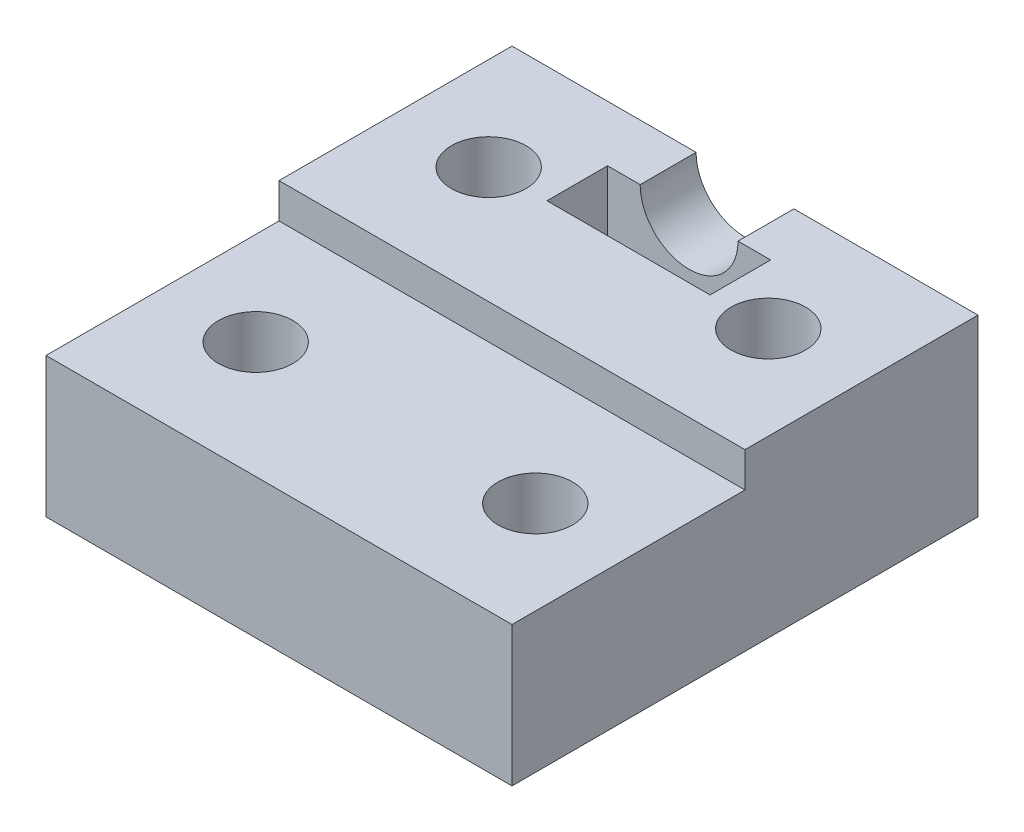
ISO-10303-21;
HEADER;
FILE_DESCRIPTION(('STEP AP214'),'2;1');
FILE_NAME('part.step','',(''),(''),'','','');
FILE_SCHEMA(('AUTOMOTIVE_DESIGN { 1 0 10303 214 1 1 1 1 }'));
ENDSEC;
DATA;
#1=APPLICATION_CONTEXT('core data for automotive mechanical design processes');
#2=APPLICATION_PROTOCOL_DEFINITION('international standard','automotive_design',2000,#1);
#3=PRODUCT_CONTEXT('',#1,'mechanical');
#4=PRODUCT('Part','Part','',(#3));
#5=PRODUCT_RELATED_PRODUCT_CATEGORY('part','',(#4));
#6=PRODUCT_DEFINITION_FORMATION('','',#4);
#7=PRODUCT_DEFINITION_CONTEXT('part definition',#1,'design');
#8=PRODUCT_DEFINITION('design','',#6,#7);
#9=PRODUCT_DEFINITION_SHAPE('','',#8);
#10=(LENGTH_UNIT() NAMED_UNIT(*) SI_UNIT(.MILLI.,.METRE.));
#11=(NAMED_UNIT(*) PLANE_ANGLE_UNIT() SI_UNIT($,.RADIAN.));
#12=(NAMED_UNIT(*) SI_UNIT($,.STERADIAN.) SOLID_ANGLE_UNIT());
#13=UNCERTAINTY_MEASURE_WITH_UNIT(LENGTH_MEASURE(1.E-05),#10,'distance_accuracy_value','');
#14=(GEOMETRIC_REPRESENTATION_CONTEXT(3) GLOBAL_UNCERTAINTY_ASSIGNED_CONTEXT((#13)) GLOBAL_UNIT_ASSIGNED_CONTEXT((#10,
#11,#12)) REPRESENTATION_CONTEXT('',''));
#15=CARTESIAN_POINT('',(0.,0.,0.));
#16=DIRECTION('',(0.,0.,1.));
#17=DIRECTION('',(1.,0.,0.));
#18=AXIS2_PLACEMENT_3D('',#15,#16,#17);
#19=CARTESIAN_POINT('',(0.,0.,0.));
#20=DIRECTION('',(0.,-1.,0.));
#21=DIRECTION('',(0.,0.,-1.));
#22=AXIS2_PLACEMENT_3D('',#19,#20,#21);
#23=PLANE('',#22);
#24=CARTESIAN_POINT('',(-6.,0.,-5.));
#25=DIRECTION('',(0.,1.,0.));
#26=DIRECTION('',(0.,0.,1.));
#27=AXIS2_PLACEMENT_3D('',#24,#25,#26);
#28=CIRCLE('',#27,1.6);
#29=CARTESIAN_POINT('',(-6.,0.,-3.4));
#30=VERTEX_POINT('',#29);
#31=EDGE_CURVE('E401',#30,#30,#28,.T.);
#32=ORIENTED_EDGE('',*,*,#31,.F.);
#33=EDGE_LOOP('',(#32));
#34=FACE_BOUND('',#33,.T.);
#35=CARTESIAN_POINT('',(6.,0.,-5.));
#36=DIRECTION('',(0.,1.,0.));
#37=DIRECTION('',(0.,0.,1.));
#38=AXIS2_PLACEMENT_3D('',#35,#36,#37);
#39=CIRCLE('',#38,1.6);
#40=CARTESIAN_POINT('',(6.,0.,-3.4));
#41=VERTEX_POINT('',#40);
#42=EDGE_CURVE('E403',#41,#41,#39,.T.);
#43=ORIENTED_EDGE('',*,*,#42,.F.);
#44=EDGE_LOOP('',(#43));
#45=FACE_BOUND('',#44,.T.);
#46=DIRECTION('',(-1.,0.,0.));
#47=VECTOR('',#46,1.);
#48=CARTESIAN_POINT('',(9.99999999999999,0.,-10.));
#49=LINE('',#48,#47);
#50=CARTESIAN_POINT('',(9.99999999999999,0.,-10.));
#51=VERTEX_POINT('',#50);
#52=CARTESIAN_POINT('',(2.1,0.,-10.));
#53=VERTEX_POINT('',#52);
#54=EDGE_CURVE('E134',#51,#53,#49,.T.);
#55=ORIENTED_EDGE('',*,*,#54,.T.);
#56=DIRECTION('',(0.,0.,1.));
#57=VECTOR('',#56,1.);
#58=CARTESIAN_POINT('',(2.1,0.,-10.));
#59=LINE('',#58,#57);
#60=CARTESIAN_POINT('',(2.1,0.,-7.6));
#61=VERTEX_POINT('',#60);
#62=EDGE_CURVE('E121',#53,#61,#59,.T.);
#63=ORIENTED_EDGE('',*,*,#62,.T.);
#64=DIRECTION('',(-1.,0.,0.));
#65=VECTOR('',#64,1.);
#66=CARTESIAN_POINT('',(0.,0.,-7.6));
#67=LINE('',#66,#65);
#68=CARTESIAN_POINT('',(3.5,0.,-7.6));
#69=VERTEX_POINT('',#68);
#70=EDGE_CURVE('E11',#69,#61,#67,.T.);
#71=ORIENTED_EDGE('',*,*,#70,.F.);
#72=DIRECTION('',(0.,0.,1.));
#73=VECTOR('',#72,1.);
#74=CARTESIAN_POINT('',(3.5,0.,0.));
#75=LINE('',#74,#73);
#76=CARTESIAN_POINT('',(3.5,0.,-5.));
#77=VERTEX_POINT('',#76);
#78=EDGE_CURVE('E166',#69,#77,#75,.T.);
#79=ORIENTED_EDGE('',*,*,#78,.T.);
#80=DIRECTION('',(-1.,0.,0.));
#81=VECTOR('',#80,1.);
#82=CARTESIAN_POINT('',(0.,0.,-5.));
#83=LINE('',#82,#81);
#84=CARTESIAN_POINT('',(-3.5,0.,-5.));
#85=VERTEX_POINT('',#84);
#86=EDGE_CURVE('E56',#77,#85,#83,.T.);
#87=ORIENTED_EDGE('',*,*,#86,.T.);
#88=DIRECTION('',(0.,0.,-1.));
#89=VECTOR('',#88,1.);
#90=CARTESIAN_POINT('',(-3.5,0.,0.));
#91=LINE('',#90,#89);
#92=CARTESIAN_POINT('',(-3.5,0.,-7.6));
#93=VERTEX_POINT('',#92);
#94=EDGE_CURVE('E165',#85,#93,#91,.T.);
#95=ORIENTED_EDGE('',*,*,#94,.T.);
#96=CARTESIAN_POINT('',(-2.1,0.,-7.6));
#97=VERTEX_POINT('',#96);
#98=EDGE_CURVE('E41',#97,#93,#67,.T.);
#99=ORIENTED_EDGE('',*,*,#98,.F.);
#100=DIRECTION('',(0.,0.,1.));
#101=VECTOR('',#100,1.);
#102=CARTESIAN_POINT('',(-2.1,0.,-10.));
#103=LINE('',#102,#101);
#104=CARTESIAN_POINT('',(-2.1,0.,-10.));
#105=VERTEX_POINT('',#104);
#106=EDGE_CURVE('E48',#97,#105,#103,.F.);
#107=ORIENTED_EDGE('',*,*,#106,.T.);
#108=CARTESIAN_POINT('',(-10.,0.,-10.));
#109=VERTEX_POINT('',#108);
#110=EDGE_CURVE('E136',#105,#109,#49,.T.);
#111=ORIENTED_EDGE('',*,*,#110,.T.);
#112=DIRECTION('',(0.,0.,1.));
#113=VECTOR('',#112,1.);
#114=CARTESIAN_POINT('',(-10.,0.,-10.));
#115=LINE('',#114,#113);
#116=CARTESIAN_POINT('',(-10.,0.,0.));
#117=VERTEX_POINT('',#116);
#118=EDGE_CURVE('E210',#109,#117,#115,.T.);
#119=ORIENTED_EDGE('',*,*,#118,.T.);
#120=DIRECTION('',(1.,0.,0.));
#121=VECTOR('',#120,1.);
#122=CARTESIAN_POINT('',(0.,0.,0.));
#123=LINE('',#122,#121);
#124=CARTESIAN_POINT('',(10.,0.,0.));
#125=VERTEX_POINT('',#124);
#126=EDGE_CURVE('E153',#117,#125,#123,.T.);
#127=ORIENTED_EDGE('',*,*,#126,.T.);
#128=DIRECTION('',(0.,0.,-1.));
#129=VECTOR('',#128,1.);
#130=CARTESIAN_POINT('',(9.99999999999999,0.,-10.));
#131=LINE('',#130,#129);
#132=EDGE_CURVE('E141',#125,#51,#131,.T.);
#133=ORIENTED_EDGE('',*,*,#132,.T.);
#134=EDGE_LOOP('',(#55,#63,#71,#79,#87,#95,#99,#107,#111,#119,#127,#133));
#135=FACE_BOUND('',#134,.T.);
#136=ADVANCED_FACE('F33',(#34,#45,#135),#23,.F.);
#137=CARTESIAN_POINT('',(-10.,-7.5,-10.));
#138=DIRECTION('',(-1.,0.,0.));
#139=DIRECTION('',(0.,0.,1.));
#140=AXIS2_PLACEMENT_3D('',#137,#138,#139);
#141=PLANE('',#140);
#142=DIRECTION('',(0.,0.,1.));
#143=VECTOR('',#142,1.);
#144=CARTESIAN_POINT('',(-10.,-1.5,0.));
#145=LINE('',#144,#143);
#146=CARTESIAN_POINT('',(-10.,-1.5,0.));
#147=VERTEX_POINT('',#146);
#148=CARTESIAN_POINT('',(-10.,-1.5,10.));
#149=VERTEX_POINT('',#148);
#150=EDGE_CURVE('E205',#147,#149,#145,.T.);
#151=ORIENTED_EDGE('',*,*,#150,.F.);
#152=DIRECTION('',(0.,-1.,0.));
#153=VECTOR('',#152,1.);
#154=CARTESIAN_POINT('',(-10.,1.5,0.));
#155=LINE('',#154,#153);
#156=EDGE_CURVE('E198',#117,#147,#155,.T.);
#157=ORIENTED_EDGE('',*,*,#156,.F.);
#158=ORIENTED_EDGE('',*,*,#118,.F.);
#159=DIRECTION('',(0.,1.,0.));
#160=VECTOR('',#159,1.);
#161=CARTESIAN_POINT('',(-10.,-7.5,-10.));
#162=LINE('',#161,#160);
#163=CARTESIAN_POINT('',(-10.,-7.5,-10.));
#164=VERTEX_POINT('',#163);
#165=EDGE_CURVE('E151',#164,#109,#162,.T.);
#166=ORIENTED_EDGE('',*,*,#165,.F.);
#167=DIRECTION('',(0.,0.,1.));
#168=VECTOR('',#167,1.);
#169=CARTESIAN_POINT('',(-10.,-7.5,-10.));
#170=LINE('',#169,#168);
#171=CARTESIAN_POINT('',(-10.,-7.5,10.));
#172=VERTEX_POINT('',#171);
#173=EDGE_CURVE('E143',#164,#172,#170,.T.);
#174=ORIENTED_EDGE('',*,*,#173,.T.);
#175=DIRECTION('',(0.,1.,0.));
#176=VECTOR('',#175,1.);
#177=CARTESIAN_POINT('',(-10.,-7.5,10.));
#178=LINE('',#177,#176);
#179=EDGE_CURVE('E159',#172,#149,#178,.T.);
#180=ORIENTED_EDGE('',*,*,#179,.T.);
#181=EDGE_LOOP('',(#151,#157,#158,#166,#174,#180));
#182=FACE_BOUND('',#181,.T.);
#183=ADVANCED_FACE('F35',(#182),#141,.T.);
#184=CARTESIAN_POINT('',(9.99999999999999,-7.5,-10.));
#185=DIRECTION('',(0.,0.,-1.));
#186=DIRECTION('',(-1.,0.,0.));
#187=AXIS2_PLACEMENT_3D('',#184,#185,#186);
#188=PLANE('',#187);
#189=CARTESIAN_POINT('',(0.,0.,-10.));
#190=DIRECTION('',(0.,0.,1.));
#191=DIRECTION('',(1.,0.,0.));
#192=AXIS2_PLACEMENT_3D('',#189,#190,#191);
#193=CIRCLE('',#192,2.1);
#194=EDGE_CURVE('E124',#105,#53,#193,.T.);
#195=ORIENTED_EDGE('',*,*,#194,.T.);
#196=ORIENTED_EDGE('',*,*,#54,.F.);
#197=DIRECTION('',(0.,1.,0.));
#198=VECTOR('',#197,1.);
#199=CARTESIAN_POINT('',(9.99999999999999,-7.5,-10.));
#200=LINE('',#199,#198);
#201=CARTESIAN_POINT('',(9.99999999999999,-7.5,-10.));
#202=VERTEX_POINT('',#201);
#203=EDGE_CURVE('E154',#202,#51,#200,.T.);
#204=ORIENTED_EDGE('',*,*,#203,.F.);
#205=DIRECTION('',(-1.,0.,0.));
#206=VECTOR('',#205,1.);
#207=CARTESIAN_POINT('',(9.99999999999999,-7.5,-10.));
#208=LINE('',#207,#206);
#209=EDGE_CURVE('E162',#202,#164,#208,.T.);
#210=ORIENTED_EDGE('',*,*,#209,.T.);
#211=ORIENTED_EDGE('',*,*,#165,.T.);
#212=ORIENTED_EDGE('',*,*,#110,.F.);
#213=EDGE_LOOP('',(#195,#196,#204,#210,#211,#212));
#214=FACE_BOUND('',#213,.T.);
#215=ADVANCED_FACE('F133',(#214),#188,.T.);
#216=CARTESIAN_POINT('',(9.99999999999999,-7.5,-10.));
#217=DIRECTION('',(1.,0.,0.));
#218=DIRECTION('',(0.,0.,-1.));
#219=AXIS2_PLACEMENT_3D('',#216,#217,#218);
#220=PLANE('',#219);
#221=DIRECTION('',(0.,0.,1.));
#222=VECTOR('',#221,1.);
#223=CARTESIAN_POINT('',(10.,-1.5,0.));
#224=LINE('',#223,#222);
#225=CARTESIAN_POINT('',(10.,-1.5,0.));
#226=VERTEX_POINT('',#225);
#227=CARTESIAN_POINT('',(10.,-1.5,10.));
#228=VERTEX_POINT('',#227);
#229=EDGE_CURVE('E207',#226,#228,#224,.T.);
#230=ORIENTED_EDGE('',*,*,#229,.T.);
#231=DIRECTION('',(0.,1.,0.));
#232=VECTOR('',#231,1.);
#233=CARTESIAN_POINT('',(10.,-7.5,10.));
#234=LINE('',#233,#232);
#235=CARTESIAN_POINT('',(10.,-7.5,10.));
#236=VERTEX_POINT('',#235);
#237=EDGE_CURVE('E156',#236,#228,#234,.T.);
#238=ORIENTED_EDGE('',*,*,#237,.F.);
#239=DIRECTION('',(0.,0.,-1.));
#240=VECTOR('',#239,1.);
#241=CARTESIAN_POINT('',(9.99999999999999,-7.5,-10.));
#242=LINE('',#241,#240);
#243=EDGE_CURVE('E214',#236,#202,#242,.T.);
#244=ORIENTED_EDGE('',*,*,#243,.T.);
#245=ORIENTED_EDGE('',*,*,#203,.T.);
#246=ORIENTED_EDGE('',*,*,#132,.F.);
#247=DIRECTION('',(0.,1.,0.));
#248=VECTOR('',#247,1.);
#249=CARTESIAN_POINT('',(10.,1.5,0.));
#250=LINE('',#249,#248);
#251=EDGE_CURVE('E203',#226,#125,#250,.T.);
#252=ORIENTED_EDGE('',*,*,#251,.F.);
#253=EDGE_LOOP('',(#230,#238,#244,#245,#246,#252));
#254=FACE_BOUND('',#253,.T.);
#255=ADVANCED_FACE('F232',(#254),#220,.T.);
#256=CARTESIAN_POINT('',(10.,-7.5,10.));
#257=DIRECTION('',(0.,0.,1.));
#258=DIRECTION('',(1.,0.,0.));
#259=AXIS2_PLACEMENT_3D('',#256,#257,#258);
#260=PLANE('',#259);
#261=DIRECTION('',(1.,0.,0.));
#262=VECTOR('',#261,1.);
#263=CARTESIAN_POINT('',(10.,-1.5,10.));
#264=LINE('',#263,#262);
#265=EDGE_CURVE('E196',#149,#228,#264,.T.);
#266=ORIENTED_EDGE('',*,*,#265,.F.);
#267=ORIENTED_EDGE('',*,*,#179,.F.);
#268=DIRECTION('',(1.,0.,0.));
#269=VECTOR('',#268,1.);
#270=CARTESIAN_POINT('',(10.,-7.5,10.));
#271=LINE('',#270,#269);
#272=EDGE_CURVE('E146',#172,#236,#271,.T.);
#273=ORIENTED_EDGE('',*,*,#272,.T.);
#274=ORIENTED_EDGE('',*,*,#237,.T.);
#275=EDGE_LOOP('',(#266,#267,#273,#274));
#276=FACE_BOUND('',#275,.T.);
#277=ADVANCED_FACE('F235',(#276),#260,.T.);
#278=CARTESIAN_POINT('',(0.,-7.5,0.));
#279=DIRECTION('',(0.,-1.,0.));
#280=DIRECTION('',(0.,0.,-1.));
#281=AXIS2_PLACEMENT_3D('',#278,#279,#280);
#282=PLANE('',#281);
#283=CARTESIAN_POINT('',(-6.,-7.5,-5.));
#284=DIRECTION('',(0.,1.,0.));
#285=DIRECTION('',(0.,0.,1.));
#286=AXIS2_PLACEMENT_3D('',#283,#284,#285);
#287=CIRCLE('',#286,1.6);
#288=CARTESIAN_POINT('',(-6.,-7.5,-3.4));
#289=VERTEX_POINT('',#288);
#290=EDGE_CURVE('E399',#289,#289,#287,.T.);
#291=ORIENTED_EDGE('',*,*,#290,.T.);
#292=EDGE_LOOP('',(#291));
#293=FACE_BOUND('',#292,.T.);
#294=CARTESIAN_POINT('',(6.,-7.5,-5.));
#295=DIRECTION('',(0.,1.,0.));
#296=DIRECTION('',(0.,0.,1.));
#297=AXIS2_PLACEMENT_3D('',#294,#295,#296);
#298=CIRCLE('',#297,1.6);
#299=CARTESIAN_POINT('',(6.,-7.5,-3.40000000000001));
#300=VERTEX_POINT('',#299);
#301=EDGE_CURVE('E408',#300,#300,#298,.T.);
#302=ORIENTED_EDGE('',*,*,#301,.T.);
#303=EDGE_LOOP('',(#302));
#304=FACE_BOUND('',#303,.T.);
#305=CARTESIAN_POINT('',(-6.,-7.5,5.));
#306=DIRECTION('',(0.,1.,0.));
#307=DIRECTION('',(0.,0.,1.));
#308=AXIS2_PLACEMENT_3D('',#305,#306,#307);
#309=CIRCLE('',#308,1.6);
#310=CARTESIAN_POINT('',(-6.,-7.5,6.6));
#311=VERTEX_POINT('',#310);
#312=EDGE_CURVE('E414',#311,#311,#309,.T.);
#313=ORIENTED_EDGE('',*,*,#312,.T.);
#314=EDGE_LOOP('',(#313));
#315=FACE_BOUND('',#314,.T.);
#316=CARTESIAN_POINT('',(6.,-7.5,5.));
#317=DIRECTION('',(0.,1.,0.));
#318=DIRECTION('',(0.,0.,1.));
#319=AXIS2_PLACEMENT_3D('',#316,#317,#318);
#320=CIRCLE('',#319,1.6);
#321=CARTESIAN_POINT('',(6.,-7.5,6.6));
#322=VERTEX_POINT('',#321);
#323=EDGE_CURVE('E137',#322,#322,#320,.T.);
#324=ORIENTED_EDGE('',*,*,#323,.T.);
#325=EDGE_LOOP('',(#324));
#326=FACE_BOUND('',#325,.T.);
#327=ORIENTED_EDGE('',*,*,#173,.F.);
#328=ORIENTED_EDGE('',*,*,#209,.F.);
#329=ORIENTED_EDGE('',*,*,#243,.F.);
#330=ORIENTED_EDGE('',*,*,#272,.F.);
#331=EDGE_LOOP('',(#327,#328,#329,#330));
#332=FACE_BOUND('',#331,.T.);
#333=ADVANCED_FACE('F238',(#293,#304,#315,#326,#332),#282,.T.);
#334=CARTESIAN_POINT('',(0.,0.,0.));
#335=DIRECTION('',(0.,0.,-1.));
#336=DIRECTION('',(-1.,0.,0.));
#337=AXIS2_PLACEMENT_3D('',#334,#335,#336);
#338=PLANE('',#337);
#339=ORIENTED_EDGE('',*,*,#156,.T.);
#340=DIRECTION('',(1.,0.,0.));
#341=VECTOR('',#340,1.);
#342=CARTESIAN_POINT('',(10.,-1.5,0.));
#343=LINE('',#342,#341);
#344=EDGE_CURVE('E200',#147,#226,#343,.T.);
#345=ORIENTED_EDGE('',*,*,#344,.T.);
#346=ORIENTED_EDGE('',*,*,#251,.T.);
#347=ORIENTED_EDGE('',*,*,#126,.F.);
#348=EDGE_LOOP('',(#339,#345,#346,#347));
#349=FACE_BOUND('',#348,.T.);
#350=ADVANCED_FACE('F226',(#349),#338,.F.);
#351=CARTESIAN_POINT('',(10.,-1.5,0.));
#352=DIRECTION('',(0.,-1.,0.));
#353=DIRECTION('',(1.,0.,0.));
#354=AXIS2_PLACEMENT_3D('',#351,#352,#353);
#355=PLANE('',#354);
#356=CARTESIAN_POINT('',(-6.,-1.5,5.));
#357=DIRECTION('',(0.,1.,0.));
#358=DIRECTION('',(0.,0.,1.));
#359=AXIS2_PLACEMENT_3D('',#356,#357,#358);
#360=CIRCLE('',#359,1.6);
#361=CARTESIAN_POINT('',(-6.,-1.5,6.6));
#362=VERTEX_POINT('',#361);
#363=EDGE_CURVE('E411',#362,#362,#360,.T.);
#364=ORIENTED_EDGE('',*,*,#363,.F.);
#365=EDGE_LOOP('',(#364));
#366=FACE_BOUND('',#365,.T.);
#367=CARTESIAN_POINT('',(6.,-1.5,5.));
#368=DIRECTION('',(0.,1.,0.));
#369=DIRECTION('',(0.,0.,1.));
#370=AXIS2_PLACEMENT_3D('',#367,#368,#369);
#371=CIRCLE('',#370,1.6);
#372=CARTESIAN_POINT('',(6.,-1.5,6.6));
#373=VERTEX_POINT('',#372);
#374=EDGE_CURVE('E417',#373,#373,#371,.T.);
#375=ORIENTED_EDGE('',*,*,#374,.F.);
#376=EDGE_LOOP('',(#375));
#377=FACE_BOUND('',#376,.T.);
#378=ORIENTED_EDGE('',*,*,#265,.T.);
#379=ORIENTED_EDGE('',*,*,#229,.F.);
#380=ORIENTED_EDGE('',*,*,#344,.F.);
#381=ORIENTED_EDGE('',*,*,#150,.T.);
#382=EDGE_LOOP('',(#378,#379,#380,#381));
#383=FACE_BOUND('',#382,.T.);
#384=ADVANCED_FACE('F229',(#366,#377,#383),#355,.F.);
#385=CARTESIAN_POINT('',(3.5,3.5,-7.6));
#386=DIRECTION('',(1.,0.,0.));
#387=DIRECTION('',(0.,1.,0.));
#388=AXIS2_PLACEMENT_3D('',#385,#386,#387);
#389=PLANE('',#388);
#390=DIRECTION('',(0.,1.,0.));
#391=VECTOR('',#390,1.);
#392=CARTESIAN_POINT('',(3.5,3.5,-7.6));
#393=LINE('',#392,#391);
#394=CARTESIAN_POINT('',(3.5,-3.5,-7.6));
#395=VERTEX_POINT('',#394);
#396=EDGE_CURVE('E181',#395,#69,#393,.T.);
#397=ORIENTED_EDGE('',*,*,#396,.F.);
#398=DIRECTION('',(0.,0.,1.));
#399=VECTOR('',#398,1.);
#400=CARTESIAN_POINT('',(3.5,-3.5,-7.6));
#401=LINE('',#400,#399);
#402=CARTESIAN_POINT('',(3.5,-3.5,-5.));
#403=VERTEX_POINT('',#402);
#404=EDGE_CURVE('E194',#395,#403,#401,.T.);
#405=ORIENTED_EDGE('',*,*,#404,.T.);
#406=DIRECTION('',(0.,1.,0.));
#407=VECTOR('',#406,1.);
#408=CARTESIAN_POINT('',(3.5,3.5,-5.));
#409=LINE('',#408,#407);
#410=EDGE_CURVE('E128',#403,#77,#409,.T.);
#411=ORIENTED_EDGE('',*,*,#410,.T.);
#412=ORIENTED_EDGE('',*,*,#78,.F.);
#413=EDGE_LOOP('',(#397,#405,#411,#412));
#414=FACE_BOUND('',#413,.T.);
#415=ADVANCED_FACE('F286',(#414),#389,.F.);
#416=CARTESIAN_POINT('',(-3.5,3.5,-7.6));
#417=DIRECTION('',(-1.,0.,0.));
#418=DIRECTION('',(0.,-1.,0.));
#419=AXIS2_PLACEMENT_3D('',#416,#417,#418);
#420=PLANE('',#419);
#421=DIRECTION('',(0.,-1.,0.));
#422=VECTOR('',#421,1.);
#423=CARTESIAN_POINT('',(-3.5,3.5,-5.));
#424=LINE('',#423,#422);
#425=CARTESIAN_POINT('',(-3.5,-3.5,-5.));
#426=VERTEX_POINT('',#425);
#427=EDGE_CURVE('E190',#85,#426,#424,.T.);
#428=ORIENTED_EDGE('',*,*,#427,.T.);
#429=DIRECTION('',(0.,0.,1.));
#430=VECTOR('',#429,1.);
#431=CARTESIAN_POINT('',(-3.5,-3.5,-7.6));
#432=LINE('',#431,#430);
#433=CARTESIAN_POINT('',(-3.5,-3.5,-7.6));
#434=VERTEX_POINT('',#433);
#435=EDGE_CURVE('E178',#434,#426,#432,.T.);
#436=ORIENTED_EDGE('',*,*,#435,.F.);
#437=DIRECTION('',(0.,-1.,0.));
#438=VECTOR('',#437,1.);
#439=CARTESIAN_POINT('',(-3.5,3.5,-7.6));
#440=LINE('',#439,#438);
#441=EDGE_CURVE('E172',#93,#434,#440,.T.);
#442=ORIENTED_EDGE('',*,*,#441,.F.);
#443=ORIENTED_EDGE('',*,*,#94,.F.);
#444=EDGE_LOOP('',(#428,#436,#442,#443));
#445=FACE_BOUND('',#444,.T.);
#446=ADVANCED_FACE('F176',(#445),#420,.F.);
#447=CARTESIAN_POINT('',(0.,0.,-7.6));
#448=DIRECTION('',(0.,0.,1.));
#449=DIRECTION('',(1.,0.,0.));
#450=AXIS2_PLACEMENT_3D('',#447,#448,#449);
#451=PLANE('',#450);
#452=CARTESIAN_POINT('',(0.,0.,-7.6));
#453=DIRECTION('',(0.,0.,1.));
#454=DIRECTION('',(1.,0.,0.));
#455=AXIS2_PLACEMENT_3D('',#452,#453,#454);
#456=CIRCLE('',#455,2.1);
#457=EDGE_CURVE('E125',#97,#61,#456,.T.);
#458=ORIENTED_EDGE('',*,*,#457,.F.);
#459=ORIENTED_EDGE('',*,*,#98,.T.);
#460=ORIENTED_EDGE('',*,*,#441,.T.);
#461=DIRECTION('',(1.,0.,0.));
#462=VECTOR('',#461,1.);
#463=CARTESIAN_POINT('',(-3.5,-3.5,-7.6));
#464=LINE('',#463,#462);
#465=EDGE_CURVE('E180',#434,#395,#464,.T.);
#466=ORIENTED_EDGE('',*,*,#465,.T.);
#467=ORIENTED_EDGE('',*,*,#396,.T.);
#468=ORIENTED_EDGE('',*,*,#70,.T.);
#469=EDGE_LOOP('',(#458,#459,#460,#466,#467,#468));
#470=FACE_BOUND('',#469,.T.);
#471=ADVANCED_FACE('F170',(#470),#451,.T.);
#472=CARTESIAN_POINT('',(0.,0.,-5.));
#473=DIRECTION('',(0.,0.,1.));
#474=DIRECTION('',(1.,0.,0.));
#475=AXIS2_PLACEMENT_3D('',#472,#473,#474);
#476=PLANE('',#475);
#477=ORIENTED_EDGE('',*,*,#427,.F.);
#478=ORIENTED_EDGE('',*,*,#86,.F.);
#479=ORIENTED_EDGE('',*,*,#410,.F.);
#480=DIRECTION('',(1.,0.,0.));
#481=VECTOR('',#480,1.);
#482=CARTESIAN_POINT('',(-3.5,-3.5,-5.));
#483=LINE('',#482,#481);
#484=EDGE_CURVE('E185',#426,#403,#483,.T.);
#485=ORIENTED_EDGE('',*,*,#484,.F.);
#486=EDGE_LOOP('',(#477,#478,#479,#485));
#487=FACE_BOUND('',#486,.T.);
#488=ADVANCED_FACE('F311',(#487),#476,.F.);
#489=CARTESIAN_POINT('',(-3.5,-3.5,-7.6));
#490=DIRECTION('',(0.,-1.,0.));
#491=DIRECTION('',(0.,0.,-1.));
#492=AXIS2_PLACEMENT_3D('',#489,#490,#491);
#493=PLANE('',#492);
#494=ORIENTED_EDGE('',*,*,#484,.T.);
#495=ORIENTED_EDGE('',*,*,#404,.F.);
#496=ORIENTED_EDGE('',*,*,#465,.F.);
#497=ORIENTED_EDGE('',*,*,#435,.T.);
#498=EDGE_LOOP('',(#494,#495,#496,#497));
#499=FACE_BOUND('',#498,.T.);
#500=ADVANCED_FACE('F307',(#499),#493,.F.);
#501=CARTESIAN_POINT('',(0.,0.,-10.));
#502=DIRECTION('',(0.,0.,1.));
#503=DIRECTION('',(1.,0.,0.));
#504=AXIS2_PLACEMENT_3D('',#501,#502,#503);
#505=CYLINDRICAL_SURFACE('',#504,2.1);
#506=ORIENTED_EDGE('',*,*,#194,.F.);
#507=ORIENTED_EDGE('',*,*,#106,.F.);
#508=ORIENTED_EDGE('',*,*,#457,.T.);
#509=ORIENTED_EDGE('',*,*,#62,.F.);
#510=EDGE_LOOP('',(#506,#507,#508,#509));
#511=FACE_BOUND('',#510,.T.);
#512=ADVANCED_FACE('F123',(#511),#505,.F.);
#513=CARTESIAN_POINT('',(6.,-1.5,5.));
#514=DIRECTION('',(0.,1.,0.));
#515=DIRECTION('',(0.,0.,1.));
#516=AXIS2_PLACEMENT_3D('',#513,#514,#515);
#517=CYLINDRICAL_SURFACE('',#516,1.6);
#518=ORIENTED_EDGE('',*,*,#323,.F.);
#519=EDGE_LOOP('',(#518));
#520=FACE_BOUND('',#519,.T.);
#521=ORIENTED_EDGE('',*,*,#374,.T.);
#522=EDGE_LOOP('',(#521));
#523=FACE_BOUND('',#522,.T.);
#524=ADVANCED_FACE('F342',(#520,#523),#517,.F.);
#525=CARTESIAN_POINT('',(-6.,-1.5,5.));
#526=DIRECTION('',(0.,1.,0.));
#527=DIRECTION('',(0.,0.,1.));
#528=AXIS2_PLACEMENT_3D('',#525,#526,#527);
#529=CYLINDRICAL_SURFACE('',#528,1.6);
#530=ORIENTED_EDGE('',*,*,#312,.F.);
#531=EDGE_LOOP('',(#530));
#532=FACE_BOUND('',#531,.T.);
#533=ORIENTED_EDGE('',*,*,#363,.T.);
#534=EDGE_LOOP('',(#533));
#535=FACE_BOUND('',#534,.T.);
#536=ADVANCED_FACE('F357',(#532,#535),#529,.F.);
#537=CARTESIAN_POINT('',(6.,0.,-5.));
#538=DIRECTION('',(0.,1.,0.));
#539=DIRECTION('',(0.,0.,1.));
#540=AXIS2_PLACEMENT_3D('',#537,#538,#539);
#541=CYLINDRICAL_SURFACE('',#540,1.6);
#542=ORIENTED_EDGE('',*,*,#301,.F.);
#543=EDGE_LOOP('',(#542));
#544=FACE_BOUND('',#543,.T.);
#545=ORIENTED_EDGE('',*,*,#42,.T.);
#546=EDGE_LOOP('',(#545));
#547=FACE_BOUND('',#546,.T.);
#548=ADVANCED_FACE('F366',(#544,#547),#541,.F.);
#549=CARTESIAN_POINT('',(-6.,0.,-5.));
#550=DIRECTION('',(0.,1.,0.));
#551=DIRECTION('',(0.,0.,1.));
#552=AXIS2_PLACEMENT_3D('',#549,#550,#551);
#553=CYLINDRICAL_SURFACE('',#552,1.6);
#554=ORIENTED_EDGE('',*,*,#290,.F.);
#555=EDGE_LOOP('',(#554));
#556=FACE_BOUND('',#555,.T.);
#557=ORIENTED_EDGE('',*,*,#31,.T.);
#558=EDGE_LOOP('',(#557));
#559=FACE_BOUND('',#558,.T.);
#560=ADVANCED_FACE('F383',(#556,#559),#553,.F.);
#561=CLOSED_SHELL('',(#136,#183,#215,#255,#277,#333,#350,#384,#415,#446,#471,#488,#500,#512,
#524,#536,#548,#560));
#562=MANIFOLD_SOLID_BREP('B2',#561);
#563=ADVANCED_BREP_SHAPE_REPRESENTATION('',(#18,#562),#14);
#564=SHAPE_DEFINITION_REPRESENTATION(#9,#563);
ENDSEC;
END-ISO-10303-21;
